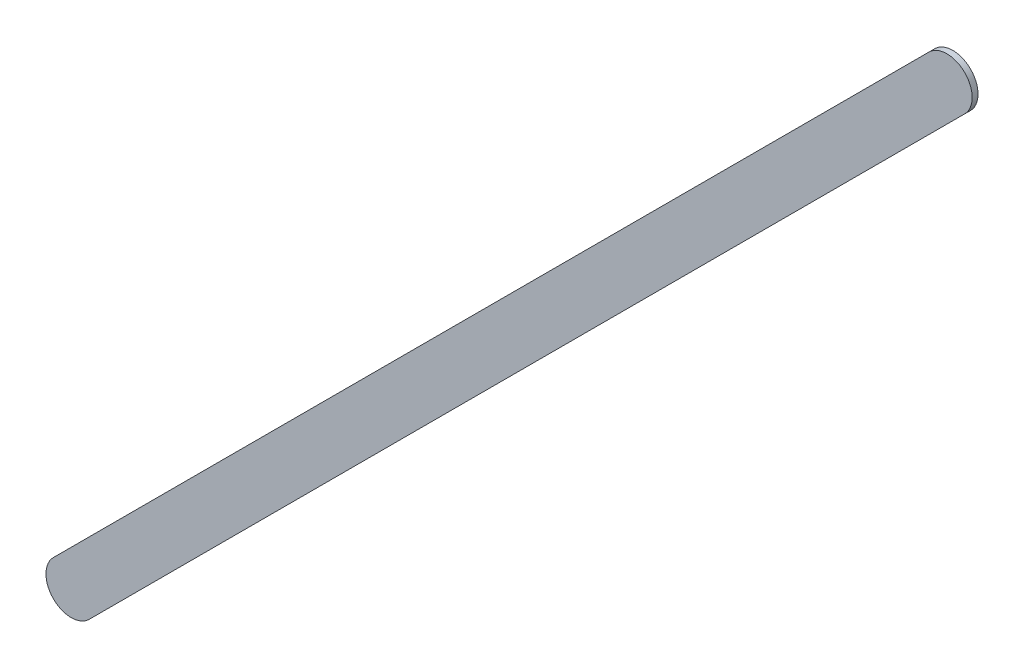
ISO-10303-21;
HEADER;
FILE_DESCRIPTION(('STEP AP214'),'2;1');
FILE_NAME('part.step','',(''),(''),'','','');
FILE_SCHEMA(('AUTOMOTIVE_DESIGN { 1 0 10303 214 1 1 1 1 }'));
ENDSEC;
DATA;
#1=APPLICATION_CONTEXT('core data for automotive mechanical design processes');
#2=APPLICATION_PROTOCOL_DEFINITION('international standard','automotive_design',2000,#1);
#3=PRODUCT_CONTEXT('',#1,'mechanical');
#4=PRODUCT('Part','Part','',(#3));
#5=PRODUCT_RELATED_PRODUCT_CATEGORY('part','',(#4));
#6=PRODUCT_DEFINITION_FORMATION('','',#4);
#7=PRODUCT_DEFINITION_CONTEXT('part definition',#1,'design');
#8=PRODUCT_DEFINITION('design','',#6,#7);
#9=PRODUCT_DEFINITION_SHAPE('','',#8);
#10=(LENGTH_UNIT() NAMED_UNIT(*) SI_UNIT(.MILLI.,.METRE.));
#11=(NAMED_UNIT(*) PLANE_ANGLE_UNIT() SI_UNIT($,.RADIAN.));
#12=(NAMED_UNIT(*) SI_UNIT($,.STERADIAN.) SOLID_ANGLE_UNIT());
#13=UNCERTAINTY_MEASURE_WITH_UNIT(LENGTH_MEASURE(1.E-05),#10,'distance_accuracy_value','');
#14=(GEOMETRIC_REPRESENTATION_CONTEXT(3) GLOBAL_UNCERTAINTY_ASSIGNED_CONTEXT((#13)) GLOBAL_UNIT_ASSIGNED_CONTEXT((#10,
#11,#12)) REPRESENTATION_CONTEXT('',''));
#15=CARTESIAN_POINT('',(0.,0.,0.));
#16=DIRECTION('',(0.,0.,1.));
#17=DIRECTION('',(1.,0.,0.));
#18=AXIS2_PLACEMENT_3D('',#15,#16,#17);
#19=CARTESIAN_POINT('',(134.866066,-66.106066,1.635));
#20=DIRECTION('',(0.,0.,1.));
#21=DIRECTION('',(1.,0.,0.));
#22=AXIS2_PLACEMENT_3D('',#19,#20,#21);
#23=PLANE('',#22);
#24=DIRECTION('',(0.707106781186548,0.707106781186548,0.));
#25=VECTOR('',#24,1.);
#26=CARTESIAN_POINT('',(134.866066,-66.106066,1.635));
#27=LINE('',#26,#25);
#28=CARTESIAN_POINT('',(134.866066,-66.106066,1.635));
#29=VERTEX_POINT('',#28);
#30=CARTESIAN_POINT('',(140.066066,-60.906066,1.635));
#31=VERTEX_POINT('',#30);
#32=EDGE_CURVE('E98',#29,#31,#27,.T.);
#33=ORIENTED_EDGE('',*,*,#32,.T.);
#34=CARTESIAN_POINT('',(139.9599995,-60.7999995,1.635));
#35=DIRECTION('',(0.,0.,1.));
#36=DIRECTION('',(0.707106781186548,-0.707106781186548,0.));
#37=AXIS2_PLACEMENT_3D('',#34,#35,#36);
#38=CIRCLE('',#37,0.150000682813);
#39=CARTESIAN_POINT('',(139.853933,-60.693933,1.635));
#40=VERTEX_POINT('',#39);
#41=EDGE_CURVE('E77',#31,#40,#38,.T.);
#42=ORIENTED_EDGE('',*,*,#41,.T.);
#43=DIRECTION('',(-0.707106781186548,-0.707106781186548,0.));
#44=VECTOR('',#43,1.);
#45=CARTESIAN_POINT('',(139.853933,-60.693933,1.635));
#46=LINE('',#45,#44);
#47=CARTESIAN_POINT('',(134.653933,-65.893933,1.635));
#48=VERTEX_POINT('',#47);
#49=EDGE_CURVE('E82',#40,#48,#46,.T.);
#50=ORIENTED_EDGE('',*,*,#49,.T.);
#51=CARTESIAN_POINT('',(134.7599995,-65.9999995,1.635));
#52=DIRECTION('',(0.,0.,1.));
#53=DIRECTION('',(-0.707106781186548,0.707106781186548,0.));
#54=AXIS2_PLACEMENT_3D('',#51,#52,#53);
#55=CIRCLE('',#54,0.150000682813);
#56=EDGE_CURVE('E11',#48,#29,#55,.T.);
#57=ORIENTED_EDGE('',*,*,#56,.T.);
#58=EDGE_LOOP('',(#33,#42,#50,#57));
#59=FACE_BOUND('',#58,.T.);
#60=ADVANCED_FACE('F17',(#59),#23,.T.);
#61=CARTESIAN_POINT('',(134.866066,-66.106066,1.6));
#62=DIRECTION('',(0.,0.,1.));
#63=DIRECTION('',(1.,0.,0.));
#64=AXIS2_PLACEMENT_3D('',#61,#62,#63);
#65=PLANE('',#64);
#66=CARTESIAN_POINT('',(134.7599995,-65.9999995,1.6));
#67=DIRECTION('',(0.,0.,1.));
#68=DIRECTION('',(-0.707106781186548,0.707106781186548,0.));
#69=AXIS2_PLACEMENT_3D('',#66,#67,#68);
#70=CIRCLE('',#69,0.150000682813);
#71=CARTESIAN_POINT('',(134.653933,-65.893933,1.6));
#72=VERTEX_POINT('',#71);
#73=CARTESIAN_POINT('',(134.866066,-66.106066,1.6));
#74=VERTEX_POINT('',#73);
#75=EDGE_CURVE('E25',#72,#74,#70,.T.);
#76=ORIENTED_EDGE('',*,*,#75,.F.);
#77=DIRECTION('',(-0.707106781186548,-0.707106781186548,0.));
#78=VECTOR('',#77,1.);
#79=CARTESIAN_POINT('',(139.853933,-60.693933,1.6));
#80=LINE('',#79,#78);
#81=CARTESIAN_POINT('',(139.853933,-60.693933,1.6));
#82=VERTEX_POINT('',#81);
#83=EDGE_CURVE('E67',#82,#72,#80,.T.);
#84=ORIENTED_EDGE('',*,*,#83,.F.);
#85=CARTESIAN_POINT('',(139.9599995,-60.7999995,1.6));
#86=DIRECTION('',(0.,0.,1.));
#87=DIRECTION('',(0.707106781186548,-0.707106781186548,0.));
#88=AXIS2_PLACEMENT_3D('',#85,#86,#87);
#89=CIRCLE('',#88,0.150000682813);
#90=CARTESIAN_POINT('',(140.066066,-60.906066,1.6));
#91=VERTEX_POINT('',#90);
#92=EDGE_CURVE('E71',#91,#82,#89,.T.);
#93=ORIENTED_EDGE('',*,*,#92,.F.);
#94=DIRECTION('',(0.707106781186548,0.707106781186548,0.));
#95=VECTOR('',#94,1.);
#96=CARTESIAN_POINT('',(134.866066,-66.106066,1.6));
#97=LINE('',#96,#95);
#98=EDGE_CURVE('E112',#74,#91,#97,.T.);
#99=ORIENTED_EDGE('',*,*,#98,.F.);
#100=EDGE_LOOP('',(#76,#84,#93,#99));
#101=FACE_BOUND('',#100,.T.);
#102=ADVANCED_FACE('F69',(#101),#65,.F.);
#103=CARTESIAN_POINT('',(134.7599995,-65.9999995,1.6));
#104=DIRECTION('',(0.,0.,-1.));
#105=DIRECTION('',(-0.707106781186548,0.707106781186548,0.));
#106=AXIS2_PLACEMENT_3D('',#103,#104,#105);
#107=CYLINDRICAL_SURFACE('',#106,0.150000682813);
#108=ORIENTED_EDGE('',*,*,#75,.T.);
#109=DIRECTION('',(0.,0.,1.));
#110=VECTOR('',#109,1.);
#111=CARTESIAN_POINT('',(134.866066,-66.106066,1.6));
#112=LINE('',#111,#110);
#113=EDGE_CURVE('E92',#74,#29,#112,.T.);
#114=ORIENTED_EDGE('',*,*,#113,.T.);
#115=ORIENTED_EDGE('',*,*,#56,.F.);
#116=DIRECTION('',(0.,0.,1.));
#117=VECTOR('',#116,1.);
#118=CARTESIAN_POINT('',(134.653933,-65.893933,1.6));
#119=LINE('',#118,#117);
#120=EDGE_CURVE('E76',#72,#48,#119,.T.);
#121=ORIENTED_EDGE('',*,*,#120,.F.);
#122=EDGE_LOOP('',(#108,#114,#115,#121));
#123=FACE_BOUND('',#122,.T.);
#124=ADVANCED_FACE('F105',(#123),#107,.T.);
#125=CARTESIAN_POINT('',(139.853933,-60.693933,1.6));
#126=DIRECTION('',(0.707106781186548,-0.707106781186548,0.));
#127=DIRECTION('',(0.,0.,-1.));
#128=AXIS2_PLACEMENT_3D('',#125,#126,#127);
#129=PLANE('',#128);
#130=ORIENTED_EDGE('',*,*,#83,.T.);
#131=ORIENTED_EDGE('',*,*,#120,.T.);
#132=ORIENTED_EDGE('',*,*,#49,.F.);
#133=DIRECTION('',(0.,0.,1.));
#134=VECTOR('',#133,1.);
#135=CARTESIAN_POINT('',(139.853933,-60.693933,1.6));
#136=LINE('',#135,#134);
#137=EDGE_CURVE('E80',#82,#40,#136,.T.);
#138=ORIENTED_EDGE('',*,*,#137,.F.);
#139=EDGE_LOOP('',(#130,#131,#132,#138));
#140=FACE_BOUND('',#139,.T.);
#141=ADVANCED_FACE('F81',(#140),#129,.F.);
#142=CARTESIAN_POINT('',(139.9599995,-60.7999995,1.6));
#143=DIRECTION('',(0.,0.,-1.));
#144=DIRECTION('',(0.707106781186548,-0.707106781186548,0.));
#145=AXIS2_PLACEMENT_3D('',#142,#143,#144);
#146=CYLINDRICAL_SURFACE('',#145,0.150000682813);
#147=ORIENTED_EDGE('',*,*,#92,.T.);
#148=ORIENTED_EDGE('',*,*,#137,.T.);
#149=ORIENTED_EDGE('',*,*,#41,.F.);
#150=DIRECTION('',(0.,0.,1.));
#151=VECTOR('',#150,1.);
#152=CARTESIAN_POINT('',(140.066066,-60.906066,1.6));
#153=LINE('',#152,#151);
#154=EDGE_CURVE('E89',#91,#31,#153,.T.);
#155=ORIENTED_EDGE('',*,*,#154,.F.);
#156=EDGE_LOOP('',(#147,#148,#149,#155));
#157=FACE_BOUND('',#156,.T.);
#158=ADVANCED_FACE('F87',(#157),#146,.T.);
#159=CARTESIAN_POINT('',(134.866066,-66.106066,1.6));
#160=DIRECTION('',(-0.707106781186548,0.707106781186548,0.));
#161=DIRECTION('',(0.,0.,1.));
#162=AXIS2_PLACEMENT_3D('',#159,#160,#161);
#163=PLANE('',#162);
#164=ORIENTED_EDGE('',*,*,#98,.T.);
#165=ORIENTED_EDGE('',*,*,#154,.T.);
#166=ORIENTED_EDGE('',*,*,#32,.F.);
#167=ORIENTED_EDGE('',*,*,#113,.F.);
#168=EDGE_LOOP('',(#164,#165,#166,#167));
#169=FACE_BOUND('',#168,.T.);
#170=ADVANCED_FACE('F111',(#169),#163,.F.);
#171=CLOSED_SHELL('',(#60,#102,#124,#141,#158,#170));
#172=MANIFOLD_SOLID_BREP('B1',#171);
#173=ADVANCED_BREP_SHAPE_REPRESENTATION('',(#18,#172),#14);
#174=SHAPE_DEFINITION_REPRESENTATION(#9,#173);
ENDSEC;
END-ISO-10303-21;
